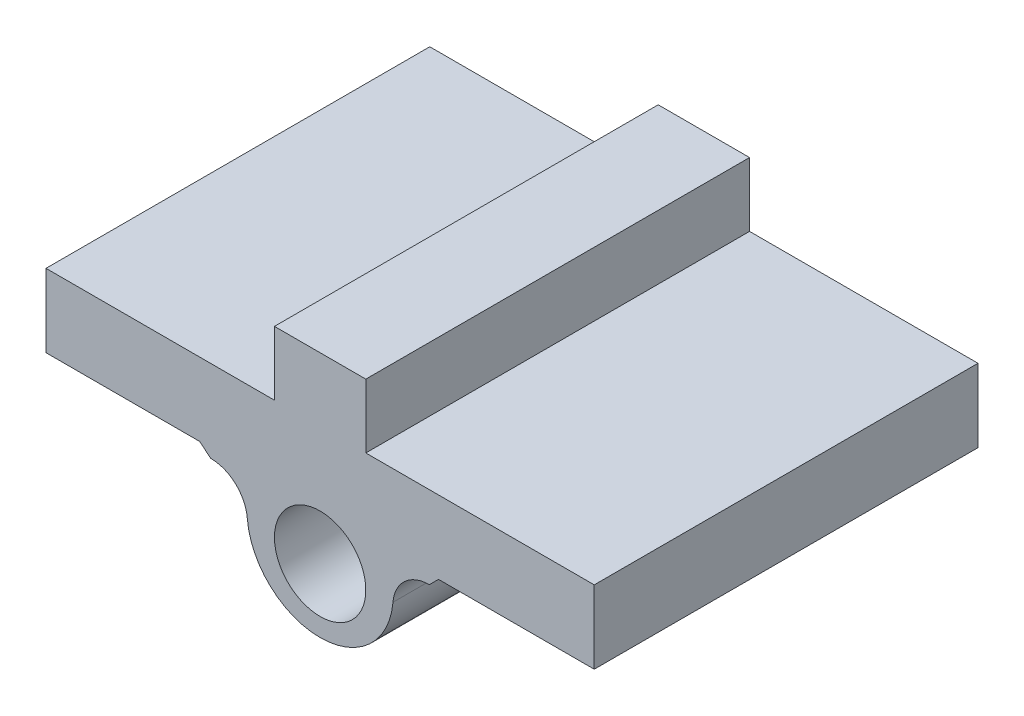
ISO-10303-21;
HEADER;
FILE_DESCRIPTION(('STEP AP214'),'2;1');
FILE_NAME('part.step','',(''),(''),'','','');
FILE_SCHEMA(('AUTOMOTIVE_DESIGN { 1 0 10303 214 1 1 1 1 }'));
ENDSEC;
DATA;
#1=APPLICATION_CONTEXT('core data for automotive mechanical design processes');
#2=APPLICATION_PROTOCOL_DEFINITION('international standard','automotive_design',2000,#1);
#3=PRODUCT_CONTEXT('',#1,'mechanical');
#4=PRODUCT('Part','Part','',(#3));
#5=PRODUCT_RELATED_PRODUCT_CATEGORY('part','',(#4));
#6=PRODUCT_DEFINITION_FORMATION('','',#4);
#7=PRODUCT_DEFINITION_CONTEXT('part definition',#1,'design');
#8=PRODUCT_DEFINITION('design','',#6,#7);
#9=PRODUCT_DEFINITION_SHAPE('','',#8);
#10=(LENGTH_UNIT() NAMED_UNIT(*) SI_UNIT(.MILLI.,.METRE.));
#11=(NAMED_UNIT(*) PLANE_ANGLE_UNIT() SI_UNIT($,.RADIAN.));
#12=(NAMED_UNIT(*) SI_UNIT($,.STERADIAN.) SOLID_ANGLE_UNIT());
#13=UNCERTAINTY_MEASURE_WITH_UNIT(LENGTH_MEASURE(1.E-05),#10,'distance_accuracy_value','');
#14=(GEOMETRIC_REPRESENTATION_CONTEXT(3) GLOBAL_UNCERTAINTY_ASSIGNED_CONTEXT((#13)) GLOBAL_UNIT_ASSIGNED_CONTEXT((#10,
#11,#12)) REPRESENTATION_CONTEXT('',''));
#15=CARTESIAN_POINT('',(0.,0.,0.));
#16=DIRECTION('',(0.,0.,1.));
#17=DIRECTION('',(1.,0.,0.));
#18=AXIS2_PLACEMENT_3D('',#15,#16,#17);
#19=CARTESIAN_POINT('',(0.,0.,0.));
#20=DIRECTION('',(0.,-1.,0.));
#21=DIRECTION('',(0.,0.,-1.));
#22=AXIS2_PLACEMENT_3D('',#19,#20,#21);
#23=PLANE('',#22);
#24=DIRECTION('',(0.,0.,-1.));
#25=VECTOR('',#24,1.);
#26=CARTESIAN_POINT('',(16.8030447960703,0.,28.7766454131789));
#27=LINE('',#26,#25);
#28=CARTESIAN_POINT('',(16.8030447960703,0.,0.));
#29=VERTEX_POINT('',#28);
#30=CARTESIAN_POINT('',(16.8030447960703,0.,-42.));
#31=VERTEX_POINT('',#30);
#32=EDGE_CURVE('E236',#29,#31,#27,.T.);
#33=ORIENTED_EDGE('',*,*,#32,.F.);
#34=DIRECTION('',(1.,0.,0.));
#35=VECTOR('',#34,1.);
#36=CARTESIAN_POINT('',(0.,0.,0.));
#37=LINE('',#36,#35);
#38=CARTESIAN_POINT('',(0.,0.,0.));
#39=VERTEX_POINT('',#38);
#40=EDGE_CURVE('E188',#39,#29,#37,.T.);
#41=ORIENTED_EDGE('',*,*,#40,.F.);
#42=DIRECTION('',(0.,0.,1.));
#43=VECTOR('',#42,1.);
#44=CARTESIAN_POINT('',(0.,0.,0.));
#45=LINE('',#44,#43);
#46=CARTESIAN_POINT('',(0.,0.,-42.));
#47=VERTEX_POINT('',#46);
#48=EDGE_CURVE('E190',#47,#39,#45,.T.);
#49=ORIENTED_EDGE('',*,*,#48,.F.);
#50=DIRECTION('',(-1.,0.,0.));
#51=VECTOR('',#50,1.);
#52=CARTESIAN_POINT('',(0.,0.,-42.));
#53=LINE('',#52,#51);
#54=EDGE_CURVE('E168',#31,#47,#53,.T.);
#55=ORIENTED_EDGE('',*,*,#54,.F.);
#56=EDGE_LOOP('',(#33,#41,#49,#55));
#57=FACE_BOUND('',#56,.T.);
#58=ADVANCED_FACE('F37',(#57),#23,.T.);
#59=CARTESIAN_POINT('',(0.,8.,0.));
#60=DIRECTION('',(0.,-1.,0.));
#61=DIRECTION('',(0.,0.,-1.));
#62=AXIS2_PLACEMENT_3D('',#59,#60,#61);
#63=PLANE('',#62);
#64=DIRECTION('',(0.,0.,1.));
#65=VECTOR('',#64,1.);
#66=CARTESIAN_POINT('',(25.,8.,-42.));
#67=LINE('',#66,#65);
#68=CARTESIAN_POINT('',(25.,8.,-42.));
#69=VERTEX_POINT('',#68);
#70=CARTESIAN_POINT('',(25.,8.,0.));
#71=VERTEX_POINT('',#70);
#72=EDGE_CURVE('E52',#69,#71,#67,.T.);
#73=ORIENTED_EDGE('',*,*,#72,.F.);
#74=DIRECTION('',(-1.,0.,0.));
#75=VECTOR('',#74,1.);
#76=CARTESIAN_POINT('',(0.,8.,-42.));
#77=LINE('',#76,#75);
#78=CARTESIAN_POINT('',(0.,8.,-42.));
#79=VERTEX_POINT('',#78);
#80=EDGE_CURVE('E196',#69,#79,#77,.T.);
#81=ORIENTED_EDGE('',*,*,#80,.T.);
#82=DIRECTION('',(0.,0.,1.));
#83=VECTOR('',#82,1.);
#84=CARTESIAN_POINT('',(0.,8.,0.));
#85=LINE('',#84,#83);
#86=CARTESIAN_POINT('',(0.,8.,0.));
#87=VERTEX_POINT('',#86);
#88=EDGE_CURVE('E167',#79,#87,#85,.T.);
#89=ORIENTED_EDGE('',*,*,#88,.T.);
#90=DIRECTION('',(1.,0.,0.));
#91=VECTOR('',#90,1.);
#92=CARTESIAN_POINT('',(0.,8.,0.));
#93=LINE('',#92,#91);
#94=EDGE_CURVE('E198',#87,#71,#93,.T.);
#95=ORIENTED_EDGE('',*,*,#94,.T.);
#96=EDGE_LOOP('',(#73,#81,#89,#95));
#97=FACE_BOUND('',#96,.T.);
#98=ADVANCED_FACE('F296',(#97),#63,.F.);
#99=DIRECTION('',(0.,0.,-1.));
#100=VECTOR('',#99,1.);
#101=CARTESIAN_POINT('',(35.,8.,-42.));
#102=LINE('',#101,#100);
#103=CARTESIAN_POINT('',(35.,8.,0.));
#104=VERTEX_POINT('',#103);
#105=CARTESIAN_POINT('',(35.,8.,-42.));
#106=VERTEX_POINT('',#105);
#107=EDGE_CURVE('E60',#104,#106,#102,.T.);
#108=ORIENTED_EDGE('',*,*,#107,.F.);
#109=CARTESIAN_POINT('',(60.,8.,0.));
#110=VERTEX_POINT('',#109);
#111=EDGE_CURVE('E171',#104,#110,#93,.T.);
#112=ORIENTED_EDGE('',*,*,#111,.T.);
#113=DIRECTION('',(0.,0.,-1.));
#114=VECTOR('',#113,1.);
#115=CARTESIAN_POINT('',(60.,8.,0.));
#116=LINE('',#115,#114);
#117=CARTESIAN_POINT('',(60.,8.,-42.));
#118=VERTEX_POINT('',#117);
#119=EDGE_CURVE('E186',#110,#118,#116,.T.);
#120=ORIENTED_EDGE('',*,*,#119,.T.);
#121=EDGE_CURVE('E180',#118,#106,#77,.T.);
#122=ORIENTED_EDGE('',*,*,#121,.T.);
#123=EDGE_LOOP('',(#108,#112,#120,#122));
#124=FACE_BOUND('',#123,.T.);
#125=ADVANCED_FACE('F294',(#124),#63,.F.);
#126=CARTESIAN_POINT('',(0.,8.,0.));
#127=DIRECTION('',(1.,0.,0.));
#128=DIRECTION('',(0.,0.,-1.));
#129=AXIS2_PLACEMENT_3D('',#126,#127,#128);
#130=PLANE('',#129);
#131=ORIENTED_EDGE('',*,*,#48,.T.);
#132=DIRECTION('',(0.,-1.,0.));
#133=VECTOR('',#132,1.);
#134=CARTESIAN_POINT('',(0.,8.,0.));
#135=LINE('',#134,#133);
#136=EDGE_CURVE('E11',#87,#39,#135,.T.);
#137=ORIENTED_EDGE('',*,*,#136,.F.);
#138=ORIENTED_EDGE('',*,*,#88,.F.);
#139=DIRECTION('',(0.,-1.,0.));
#140=VECTOR('',#139,1.);
#141=CARTESIAN_POINT('',(0.,8.,-42.));
#142=LINE('',#141,#140);
#143=EDGE_CURVE('E177',#79,#47,#142,.T.);
#144=ORIENTED_EDGE('',*,*,#143,.T.);
#145=EDGE_LOOP('',(#131,#137,#138,#144));
#146=FACE_BOUND('',#145,.T.);
#147=ADVANCED_FACE('F39',(#146),#130,.F.);
#148=CARTESIAN_POINT('',(0.,8.,0.));
#149=DIRECTION('',(0.,0.,-1.));
#150=DIRECTION('',(-1.,0.,0.));
#151=AXIS2_PLACEMENT_3D('',#148,#149,#150);
#152=PLANE('',#151);
#153=ORIENTED_EDGE('',*,*,#40,.T.);
#154=DIRECTION('',(0.778089765424907,-0.628153099921519,0.));
#155=VECTOR('',#154,1.);
#156=CARTESIAN_POINT('',(18.0417392568986,-1.,0.));
#157=LINE('',#156,#155);
#158=CARTESIAN_POINT('',(18.0417392568986,-1.,0.));
#159=VERTEX_POINT('',#158);
#160=EDGE_CURVE('E226',#29,#159,#157,.T.);
#161=ORIENTED_EDGE('',*,*,#160,.T.);
#162=CARTESIAN_POINT('',(18.0417392568986,-5.,0.));
#163=DIRECTION('',(0.,0.,-1.));
#164=DIRECTION('',(-1.,0.,0.));
#165=AXIS2_PLACEMENT_3D('',#162,#163,#164);
#166=CIRCLE('',#165,4.);
#167=CARTESIAN_POINT('',(22.0278261712657,-4.66666666666667,0.));
#168=VERTEX_POINT('',#167);
#169=EDGE_CURVE('E248',#159,#168,#166,.T.);
#170=ORIENTED_EDGE('',*,*,#169,.T.);
#171=CARTESIAN_POINT('',(30.,-4.,0.));
#172=DIRECTION('',(0.,0.,-1.));
#173=DIRECTION('',(-1.,0.,0.));
#174=AXIS2_PLACEMENT_3D('',#171,#172,#173);
#175=CIRCLE('',#174,8.);
#176=CARTESIAN_POINT('',(37.9721738287343,-4.66666666666666,0.));
#177=VERTEX_POINT('',#176);
#178=EDGE_CURVE('E250',#168,#177,#175,.F.);
#179=ORIENTED_EDGE('',*,*,#178,.T.);
#180=CARTESIAN_POINT('',(41.9582607431014,-5.,0.));
#181=DIRECTION('',(0.,0.,-1.));
#182=DIRECTION('',(-1.,0.,0.));
#183=AXIS2_PLACEMENT_3D('',#180,#181,#182);
#184=CIRCLE('',#183,4.);
#185=CARTESIAN_POINT('',(41.9582607431014,-1.,0.));
#186=VERTEX_POINT('',#185);
#187=EDGE_CURVE('E252',#177,#186,#184,.T.);
#188=ORIENTED_EDGE('',*,*,#187,.T.);
#189=DIRECTION('',(0.70710678118655,0.707106781186545,0.));
#190=VECTOR('',#189,1.);
#191=CARTESIAN_POINT('',(41.9582607431014,-1.,0.));
#192=LINE('',#191,#190);
#193=CARTESIAN_POINT('',(42.9582607431014,0.,0.));
#194=VERTEX_POINT('',#193);
#195=EDGE_CURVE('E238',#186,#194,#192,.T.);
#196=ORIENTED_EDGE('',*,*,#195,.T.);
#197=CARTESIAN_POINT('',(60.,0.,0.));
#198=VERTEX_POINT('',#197);
#199=EDGE_CURVE('E157',#194,#198,#37,.T.);
#200=ORIENTED_EDGE('',*,*,#199,.T.);
#201=DIRECTION('',(0.,-1.,0.));
#202=VECTOR('',#201,1.);
#203=CARTESIAN_POINT('',(60.,8.,0.));
#204=LINE('',#203,#202);
#205=EDGE_CURVE('E45',#110,#198,#204,.T.);
#206=ORIENTED_EDGE('',*,*,#205,.F.);
#207=ORIENTED_EDGE('',*,*,#111,.F.);
#208=DIRECTION('',(0.,-1.,0.));
#209=VECTOR('',#208,1.);
#210=CARTESIAN_POINT('',(35.,15.,0.));
#211=LINE('',#210,#209);
#212=CARTESIAN_POINT('',(35.,15.,0.));
#213=VERTEX_POINT('',#212);
#214=EDGE_CURVE('E202',#213,#104,#211,.T.);
#215=ORIENTED_EDGE('',*,*,#214,.F.);
#216=DIRECTION('',(1.,0.,0.));
#217=VECTOR('',#216,1.);
#218=CARTESIAN_POINT('',(25.,15.,0.));
#219=LINE('',#218,#217);
#220=CARTESIAN_POINT('',(25.,15.,0.));
#221=VERTEX_POINT('',#220);
#222=EDGE_CURVE('E219',#221,#213,#219,.T.);
#223=ORIENTED_EDGE('',*,*,#222,.F.);
#224=DIRECTION('',(0.,-1.,0.));
#225=VECTOR('',#224,1.);
#226=CARTESIAN_POINT('',(25.,15.,0.));
#227=LINE('',#226,#225);
#228=EDGE_CURVE('E194',#221,#71,#227,.T.);
#229=ORIENTED_EDGE('',*,*,#228,.T.);
#230=ORIENTED_EDGE('',*,*,#94,.F.);
#231=ORIENTED_EDGE('',*,*,#136,.T.);
#232=EDGE_LOOP('',(#153,#161,#170,#179,#188,#196,#200,#206,#207,#215,#223,#229,#230,#231));
#233=FACE_BOUND('',#232,.T.);
#234=CARTESIAN_POINT('',(30.,-5.,0.));
#235=DIRECTION('',(0.,0.,-1.));
#236=DIRECTION('',(-1.,0.,0.));
#237=AXIS2_PLACEMENT_3D('',#234,#235,#236);
#238=CIRCLE('',#237,5.);
#239=CARTESIAN_POINT('',(25.,-5.,0.));
#240=VERTEX_POINT('',#239);
#241=EDGE_CURVE('E215',#240,#240,#238,.T.);
#242=ORIENTED_EDGE('',*,*,#241,.T.);
#243=EDGE_LOOP('',(#242));
#244=FACE_BOUND('',#243,.T.);
#245=ADVANCED_FACE('F254',(#233,#244),#152,.F.);
#246=CARTESIAN_POINT('',(60.,8.,0.));
#247=DIRECTION('',(-1.,0.,0.));
#248=DIRECTION('',(0.,0.,1.));
#249=AXIS2_PLACEMENT_3D('',#246,#247,#248);
#250=PLANE('',#249);
#251=DIRECTION('',(0.,0.,-1.));
#252=VECTOR('',#251,1.);
#253=CARTESIAN_POINT('',(60.,0.,0.));
#254=LINE('',#253,#252);
#255=CARTESIAN_POINT('',(60.,0.,-42.));
#256=VERTEX_POINT('',#255);
#257=EDGE_CURVE('E173',#198,#256,#254,.T.);
#258=ORIENTED_EDGE('',*,*,#257,.T.);
#259=DIRECTION('',(0.,-1.,0.));
#260=VECTOR('',#259,1.);
#261=CARTESIAN_POINT('',(60.,8.,-42.));
#262=LINE('',#261,#260);
#263=EDGE_CURVE('E166',#118,#256,#262,.T.);
#264=ORIENTED_EDGE('',*,*,#263,.F.);
#265=ORIENTED_EDGE('',*,*,#119,.F.);
#266=ORIENTED_EDGE('',*,*,#205,.T.);
#267=EDGE_LOOP('',(#258,#264,#265,#266));
#268=FACE_BOUND('',#267,.T.);
#269=ADVANCED_FACE('F185',(#268),#250,.F.);
#270=CARTESIAN_POINT('',(0.,8.,-42.));
#271=DIRECTION('',(0.,0.,1.));
#272=DIRECTION('',(1.,0.,0.));
#273=AXIS2_PLACEMENT_3D('',#270,#271,#272);
#274=PLANE('',#273);
#275=DIRECTION('',(-0.778089765424907,0.628153099921519,0.));
#276=VECTOR('',#275,1.);
#277=CARTESIAN_POINT('',(18.0417392568986,-1.,-42.));
#278=LINE('',#277,#276);
#279=CARTESIAN_POINT('',(18.0417392568986,-1.,-42.));
#280=VERTEX_POINT('',#279);
#281=EDGE_CURVE('E158',#280,#31,#278,.T.);
#282=ORIENTED_EDGE('',*,*,#281,.T.);
#283=ORIENTED_EDGE('',*,*,#54,.T.);
#284=ORIENTED_EDGE('',*,*,#143,.F.);
#285=ORIENTED_EDGE('',*,*,#80,.F.);
#286=DIRECTION('',(0.,-1.,0.));
#287=VECTOR('',#286,1.);
#288=CARTESIAN_POINT('',(25.,15.,-42.));
#289=LINE('',#288,#287);
#290=CARTESIAN_POINT('',(25.,15.,-42.));
#291=VERTEX_POINT('',#290);
#292=EDGE_CURVE('E208',#291,#69,#289,.T.);
#293=ORIENTED_EDGE('',*,*,#292,.F.);
#294=DIRECTION('',(-1.,0.,0.));
#295=VECTOR('',#294,1.);
#296=CARTESIAN_POINT('',(25.,15.,-42.));
#297=LINE('',#296,#295);
#298=CARTESIAN_POINT('',(35.,15.,-42.));
#299=VERTEX_POINT('',#298);
#300=EDGE_CURVE('E211',#299,#291,#297,.T.);
#301=ORIENTED_EDGE('',*,*,#300,.F.);
#302=DIRECTION('',(0.,-1.,0.));
#303=VECTOR('',#302,1.);
#304=CARTESIAN_POINT('',(35.,15.,-42.));
#305=LINE('',#304,#303);
#306=EDGE_CURVE('E205',#299,#106,#305,.T.);
#307=ORIENTED_EDGE('',*,*,#306,.T.);
#308=ORIENTED_EDGE('',*,*,#121,.F.);
#309=ORIENTED_EDGE('',*,*,#263,.T.);
#310=CARTESIAN_POINT('',(42.9582607431014,0.,-42.));
#311=VERTEX_POINT('',#310);
#312=EDGE_CURVE('E156',#256,#311,#53,.T.);
#313=ORIENTED_EDGE('',*,*,#312,.T.);
#314=DIRECTION('',(-0.70710678118655,-0.707106781186545,0.));
#315=VECTOR('',#314,1.);
#316=CARTESIAN_POINT('',(41.9582607431014,-1.,-42.));
#317=LINE('',#316,#315);
#318=CARTESIAN_POINT('',(41.9582607431014,-1.,-42.));
#319=VERTEX_POINT('',#318);
#320=EDGE_CURVE('E138',#311,#319,#317,.T.);
#321=ORIENTED_EDGE('',*,*,#320,.T.);
#322=CARTESIAN_POINT('',(41.9582607431014,-5.,-42.));
#323=DIRECTION('',(0.,0.,1.));
#324=DIRECTION('',(-1.,0.,0.));
#325=AXIS2_PLACEMENT_3D('',#322,#323,#324);
#326=CIRCLE('',#325,4.);
#327=CARTESIAN_POINT('',(37.9721738287343,-4.66666666666666,-42.));
#328=VERTEX_POINT('',#327);
#329=EDGE_CURVE('E150',#319,#328,#326,.T.);
#330=ORIENTED_EDGE('',*,*,#329,.T.);
#331=CARTESIAN_POINT('',(30.,-4.,-42.));
#332=DIRECTION('',(0.,0.,-1.));
#333=DIRECTION('',(-1.,0.,0.));
#334=AXIS2_PLACEMENT_3D('',#331,#332,#333);
#335=CIRCLE('',#334,8.);
#336=CARTESIAN_POINT('',(22.0278261712657,-4.66666666666667,-42.));
#337=VERTEX_POINT('',#336);
#338=EDGE_CURVE('E243',#328,#337,#335,.T.);
#339=ORIENTED_EDGE('',*,*,#338,.T.);
#340=CARTESIAN_POINT('',(18.0417392568986,-5.,-42.));
#341=DIRECTION('',(0.,0.,1.));
#342=DIRECTION('',(-1.,0.,0.));
#343=AXIS2_PLACEMENT_3D('',#340,#341,#342);
#344=CIRCLE('',#343,4.);
#345=EDGE_CURVE('E240',#337,#280,#344,.T.);
#346=ORIENTED_EDGE('',*,*,#345,.T.);
#347=EDGE_LOOP('',(#282,#283,#284,#285,#293,#301,#307,#308,#309,#313,#321,#330,#339,#346));
#348=FACE_BOUND('',#347,.T.);
#349=CARTESIAN_POINT('',(30.,-5.,-42.));
#350=DIRECTION('',(0.,0.,-1.));
#351=DIRECTION('',(-1.,0.,0.));
#352=AXIS2_PLACEMENT_3D('',#349,#350,#351);
#353=CIRCLE('',#352,5.);
#354=CARTESIAN_POINT('',(25.,-5.,-42.));
#355=VERTEX_POINT('',#354);
#356=EDGE_CURVE('E223',#355,#355,#353,.T.);
#357=ORIENTED_EDGE('',*,*,#356,.F.);
#358=EDGE_LOOP('',(#357));
#359=FACE_BOUND('',#358,.T.);
#360=ADVANCED_FACE('F162',(#348,#359),#274,.F.);
#361=DIRECTION('',(0.,0.,-1.));
#362=VECTOR('',#361,1.);
#363=CARTESIAN_POINT('',(42.9582607431014,0.,28.7766454131789));
#364=LINE('',#363,#362);
#365=EDGE_CURVE('E142',#194,#311,#364,.T.);
#366=ORIENTED_EDGE('',*,*,#365,.T.);
#367=ORIENTED_EDGE('',*,*,#312,.F.);
#368=ORIENTED_EDGE('',*,*,#257,.F.);
#369=ORIENTED_EDGE('',*,*,#199,.F.);
#370=EDGE_LOOP('',(#366,#367,#368,#369));
#371=FACE_BOUND('',#370,.T.);
#372=ADVANCED_FACE('F154',(#371),#23,.T.);
#373=CARTESIAN_POINT('',(25.,15.,-42.));
#374=DIRECTION('',(1.,0.,0.));
#375=DIRECTION('',(0.,0.,-1.));
#376=AXIS2_PLACEMENT_3D('',#373,#374,#375);
#377=PLANE('',#376);
#378=ORIENTED_EDGE('',*,*,#72,.T.);
#379=ORIENTED_EDGE('',*,*,#228,.F.);
#380=DIRECTION('',(0.,0.,1.));
#381=VECTOR('',#380,1.);
#382=CARTESIAN_POINT('',(25.,15.,-42.));
#383=LINE('',#382,#381);
#384=EDGE_CURVE('E213',#291,#221,#383,.T.);
#385=ORIENTED_EDGE('',*,*,#384,.F.);
#386=ORIENTED_EDGE('',*,*,#292,.T.);
#387=EDGE_LOOP('',(#378,#379,#385,#386));
#388=FACE_BOUND('',#387,.T.);
#389=ADVANCED_FACE('F285',(#388),#377,.F.);
#390=CARTESIAN_POINT('',(35.,15.,-42.));
#391=DIRECTION('',(-1.,0.,0.));
#392=DIRECTION('',(0.,0.,1.));
#393=AXIS2_PLACEMENT_3D('',#390,#391,#392);
#394=PLANE('',#393);
#395=ORIENTED_EDGE('',*,*,#107,.T.);
#396=ORIENTED_EDGE('',*,*,#306,.F.);
#397=DIRECTION('',(0.,0.,-1.));
#398=VECTOR('',#397,1.);
#399=CARTESIAN_POINT('',(35.,15.,-42.));
#400=LINE('',#399,#398);
#401=EDGE_CURVE('E217',#213,#299,#400,.T.);
#402=ORIENTED_EDGE('',*,*,#401,.F.);
#403=ORIENTED_EDGE('',*,*,#214,.T.);
#404=EDGE_LOOP('',(#395,#396,#402,#403));
#405=FACE_BOUND('',#404,.T.);
#406=ADVANCED_FACE('F293',(#405),#394,.F.);
#407=CARTESIAN_POINT('',(0.,15.,0.));
#408=DIRECTION('',(0.,1.,0.));
#409=DIRECTION('',(0.,0.,1.));
#410=AXIS2_PLACEMENT_3D('',#407,#408,#409);
#411=PLANE('',#410);
#412=ORIENTED_EDGE('',*,*,#384,.T.);
#413=ORIENTED_EDGE('',*,*,#222,.T.);
#414=ORIENTED_EDGE('',*,*,#401,.T.);
#415=ORIENTED_EDGE('',*,*,#300,.T.);
#416=EDGE_LOOP('',(#412,#413,#414,#415));
#417=FACE_BOUND('',#416,.T.);
#418=ADVANCED_FACE('F288',(#417),#411,.T.);
#419=CARTESIAN_POINT('',(30.,-5.,0.));
#420=DIRECTION('',(0.,0.,-1.));
#421=DIRECTION('',(-1.,0.,0.));
#422=AXIS2_PLACEMENT_3D('',#419,#420,#421);
#423=CYLINDRICAL_SURFACE('',#422,5.);
#424=CARTESIAN_POINT('',(25.,-5.,0.));
#425=CARTESIAN_POINT('',(25.,-5.,-0.437499999999999));
#426=CARTESIAN_POINT('',(25.,-5.,-0.875));
#427=CARTESIAN_POINT('',(25.,-5.,-1.75));
#428=CARTESIAN_POINT('',(25.,-5.,-2.1875));
#429=CARTESIAN_POINT('',(25.,-5.,-3.0625));
#430=CARTESIAN_POINT('',(25.,-5.,-3.5));
#431=CARTESIAN_POINT('',(25.,-5.,-4.375));
#432=CARTESIAN_POINT('',(25.,-5.,-4.8125));
#433=CARTESIAN_POINT('',(25.,-5.,-5.6875));
#434=CARTESIAN_POINT('',(25.,-5.,-6.125));
#435=CARTESIAN_POINT('',(25.,-5.,-7.));
#436=CARTESIAN_POINT('',(25.,-5.,-7.4375));
#437=CARTESIAN_POINT('',(25.,-5.,-8.3125));
#438=CARTESIAN_POINT('',(25.,-5.,-8.75));
#439=CARTESIAN_POINT('',(25.,-5.,-9.625));
#440=CARTESIAN_POINT('',(25.,-5.,-10.0625));
#441=CARTESIAN_POINT('',(25.,-5.,-10.9375));
#442=CARTESIAN_POINT('',(25.,-5.,-11.375));
#443=CARTESIAN_POINT('',(25.,-5.,-12.25));
#444=CARTESIAN_POINT('',(25.,-5.,-12.6875));
#445=CARTESIAN_POINT('',(25.,-5.,-13.5625));
#446=CARTESIAN_POINT('',(25.,-5.,-14.));
#447=CARTESIAN_POINT('',(25.,-5.,-14.875));
#448=CARTESIAN_POINT('',(25.,-5.,-15.3125));
#449=CARTESIAN_POINT('',(25.,-5.,-16.1875));
#450=CARTESIAN_POINT('',(25.,-5.,-16.625));
#451=CARTESIAN_POINT('',(25.,-5.,-17.5));
#452=CARTESIAN_POINT('',(25.,-5.,-17.9375));
#453=CARTESIAN_POINT('',(25.,-5.,-18.8125));
#454=CARTESIAN_POINT('',(25.,-5.,-19.25));
#455=CARTESIAN_POINT('',(25.,-5.,-20.125));
#456=CARTESIAN_POINT('',(25.,-5.,-20.5625));
#457=CARTESIAN_POINT('',(25.,-5.,-21.4375));
#458=CARTESIAN_POINT('',(25.,-5.,-21.875));
#459=CARTESIAN_POINT('',(25.,-5.,-22.75));
#460=CARTESIAN_POINT('',(25.,-5.,-23.1875));
#461=CARTESIAN_POINT('',(25.,-5.,-24.0625));
#462=CARTESIAN_POINT('',(25.,-5.,-24.5));
#463=CARTESIAN_POINT('',(25.,-5.,-25.375));
#464=CARTESIAN_POINT('',(25.,-5.,-25.8125));
#465=CARTESIAN_POINT('',(25.,-5.,-26.6875));
#466=CARTESIAN_POINT('',(25.,-5.,-27.125));
#467=CARTESIAN_POINT('',(25.,-5.,-28.));
#468=CARTESIAN_POINT('',(25.,-5.,-28.4375));
#469=CARTESIAN_POINT('',(25.,-5.,-29.3125));
#470=CARTESIAN_POINT('',(25.,-5.,-29.75));
#471=CARTESIAN_POINT('',(25.,-5.,-30.625));
#472=CARTESIAN_POINT('',(25.,-5.,-31.0625));
#473=CARTESIAN_POINT('',(25.,-5.,-31.9375));
#474=CARTESIAN_POINT('',(25.,-5.,-32.375));
#475=CARTESIAN_POINT('',(25.,-5.,-33.25));
#476=CARTESIAN_POINT('',(25.,-5.,-33.6875));
#477=CARTESIAN_POINT('',(25.,-5.,-34.5625));
#478=CARTESIAN_POINT('',(25.,-5.,-35.));
#479=CARTESIAN_POINT('',(25.,-5.,-35.875));
#480=CARTESIAN_POINT('',(25.,-5.,-36.3125));
#481=CARTESIAN_POINT('',(25.,-5.,-37.1875));
#482=CARTESIAN_POINT('',(25.,-5.,-37.625));
#483=CARTESIAN_POINT('',(25.,-5.,-38.5));
#484=CARTESIAN_POINT('',(25.,-5.,-38.9375));
#485=CARTESIAN_POINT('',(25.,-5.,-39.8125));
#486=CARTESIAN_POINT('',(25.,-5.,-40.25));
#487=CARTESIAN_POINT('',(25.,-5.,-41.125));
#488=CARTESIAN_POINT('',(25.,-5.,-41.5625));
#489=CARTESIAN_POINT('',(25.,-5.,-42.));
#490=B_SPLINE_CURVE_WITH_KNOTS('',3,(#424,#425,#426,#427,#428,#429,#430,#431,#432,#433,#434,
#435,#436,#437,#438,#439,#440,#441,#442,#443,#444,#445,#446,#447,#448,#449,#450,#451,#452,#453,
#454,#455,#456,#457,#458,#459,#460,#461,#462,#463,#464,#465,#466,#467,#468,#469,#470,#471,#472,
#473,#474,#475,#476,#477,#478,#479,#480,#481,#482,#483,#484,#485,#486,#487,#488,#489),
.UNSPECIFIED.,.F.,.F.,(4,2,2,2,2,2,2,2,2,2,2,2,2,2,2,2,2,2,2,2,2,2,2,2,2,2,2,2,2,2,2,2,4),(0.,
1.3125,2.625,3.9375,5.25,6.5625,7.875,9.1875,10.5,11.8125,13.125,14.4375,15.75,17.0625,18.375,
19.6875,21.,22.3125,23.625,24.9375,26.25,27.5625,28.875,30.1875,31.5,32.8125,34.125,35.4375,
36.75,38.0625,39.375,40.6875,42.),.UNSPECIFIED.);
#491=EDGE_CURVE('BSEAM368',#240,#355,#490,.T.);
#492=ORIENTED_EDGE('',*,*,#241,.F.);
#493=ORIENTED_EDGE('',*,*,#356,.T.);
#494=ORIENTED_EDGE('',*,*,#491,.T.);
#495=ORIENTED_EDGE('',*,*,#491,.F.);
#496=EDGE_LOOP('',(#492,#494,#493,#495));
#497=FACE_BOUND('',#496,.T.);
#498=ADVANCED_FACE('F368',(#497),#423,.F.);
#499=CARTESIAN_POINT('',(18.0417392568986,-1.,28.7766454131789));
#500=DIRECTION('',(-0.628153099921519,-0.778089765424907,0.));
#501=DIRECTION('',(0.778089765424907,-0.628153099921519,0.));
#502=AXIS2_PLACEMENT_3D('',#499,#500,#501);
#503=PLANE('',#502);
#504=ORIENTED_EDGE('',*,*,#160,.F.);
#505=ORIENTED_EDGE('',*,*,#32,.T.);
#506=ORIENTED_EDGE('',*,*,#281,.F.);
#507=DIRECTION('',(0.,0.,-1.));
#508=VECTOR('',#507,1.);
#509=CARTESIAN_POINT('',(18.0417392568986,-1.,28.7766454131789));
#510=LINE('',#509,#508);
#511=EDGE_CURVE('E234',#159,#280,#510,.T.);
#512=ORIENTED_EDGE('',*,*,#511,.F.);
#513=EDGE_LOOP('',(#504,#505,#506,#512));
#514=FACE_BOUND('',#513,.T.);
#515=ADVANCED_FACE('F272',(#514),#503,.T.);
#516=CARTESIAN_POINT('',(18.0417392568986,-5.,28.7766454131789));
#517=DIRECTION('',(0.,0.,-1.));
#518=DIRECTION('',(-1.,0.,0.));
#519=AXIS2_PLACEMENT_3D('',#516,#517,#518);
#520=CYLINDRICAL_SURFACE('',#519,4.);
#521=ORIENTED_EDGE('',*,*,#169,.F.);
#522=ORIENTED_EDGE('',*,*,#511,.T.);
#523=ORIENTED_EDGE('',*,*,#345,.F.);
#524=DIRECTION('',(0.,0.,-1.));
#525=VECTOR('',#524,1.);
#526=CARTESIAN_POINT('',(22.0278261712657,-4.66666666666667,28.7766454131789));
#527=LINE('',#526,#525);
#528=EDGE_CURVE('E232',#168,#337,#527,.T.);
#529=ORIENTED_EDGE('',*,*,#528,.F.);
#530=EDGE_LOOP('',(#521,#522,#523,#529));
#531=FACE_BOUND('',#530,.T.);
#532=ADVANCED_FACE('F268',(#531),#520,.F.);
#533=CARTESIAN_POINT('',(30.,-4.,28.7766454131789));
#534=DIRECTION('',(0.,0.,-1.));
#535=DIRECTION('',(-1.,0.,0.));
#536=AXIS2_PLACEMENT_3D('',#533,#534,#535);
#537=CYLINDRICAL_SURFACE('',#536,8.);
#538=ORIENTED_EDGE('',*,*,#178,.F.);
#539=ORIENTED_EDGE('',*,*,#528,.T.);
#540=ORIENTED_EDGE('',*,*,#338,.F.);
#541=DIRECTION('',(0.,0.,-1.));
#542=VECTOR('',#541,1.);
#543=CARTESIAN_POINT('',(37.9721738287343,-4.66666666666666,28.7766454131789));
#544=LINE('',#543,#542);
#545=EDGE_CURVE('E230',#177,#328,#544,.T.);
#546=ORIENTED_EDGE('',*,*,#545,.F.);
#547=EDGE_LOOP('',(#538,#539,#540,#546));
#548=FACE_BOUND('',#547,.T.);
#549=ADVANCED_FACE('F264',(#548),#537,.T.);
#550=CARTESIAN_POINT('',(41.9582607431014,-5.,28.7766454131789));
#551=DIRECTION('',(0.,0.,-1.));
#552=DIRECTION('',(-1.,0.,0.));
#553=AXIS2_PLACEMENT_3D('',#550,#551,#552);
#554=CYLINDRICAL_SURFACE('',#553,4.);
#555=ORIENTED_EDGE('',*,*,#187,.F.);
#556=ORIENTED_EDGE('',*,*,#545,.T.);
#557=ORIENTED_EDGE('',*,*,#329,.F.);
#558=DIRECTION('',(0.,0.,-1.));
#559=VECTOR('',#558,1.);
#560=CARTESIAN_POINT('',(41.9582607431014,-1.,28.7766454131789));
#561=LINE('',#560,#559);
#562=EDGE_CURVE('E145',#186,#319,#561,.T.);
#563=ORIENTED_EDGE('',*,*,#562,.F.);
#564=EDGE_LOOP('',(#555,#556,#557,#563));
#565=FACE_BOUND('',#564,.T.);
#566=ADVANCED_FACE('F258',(#565),#554,.F.);
#567=CARTESIAN_POINT('',(41.9582607431014,-1.,28.7766454131789));
#568=DIRECTION('',(0.707106781186545,-0.70710678118655,0.));
#569=DIRECTION('',(0.70710678118655,0.707106781186545,0.));
#570=AXIS2_PLACEMENT_3D('',#567,#568,#569);
#571=PLANE('',#570);
#572=ORIENTED_EDGE('',*,*,#195,.F.);
#573=ORIENTED_EDGE('',*,*,#562,.T.);
#574=ORIENTED_EDGE('',*,*,#320,.F.);
#575=ORIENTED_EDGE('',*,*,#365,.F.);
#576=EDGE_LOOP('',(#572,#573,#574,#575));
#577=FACE_BOUND('',#576,.T.);
#578=ADVANCED_FACE('F141',(#577),#571,.T.);
#579=CLOSED_SHELL('',(#58,#98,#125,#147,#245,#269,#360,#372,#389,#406,#418,#498,#515,#532,#549,
#566,#578));
#580=MANIFOLD_SOLID_BREP('B2',#579);
#581=ADVANCED_BREP_SHAPE_REPRESENTATION('',(#18,#580),#14);
#582=SHAPE_DEFINITION_REPRESENTATION(#9,#581);
ENDSEC;
END-ISO-10303-21;
